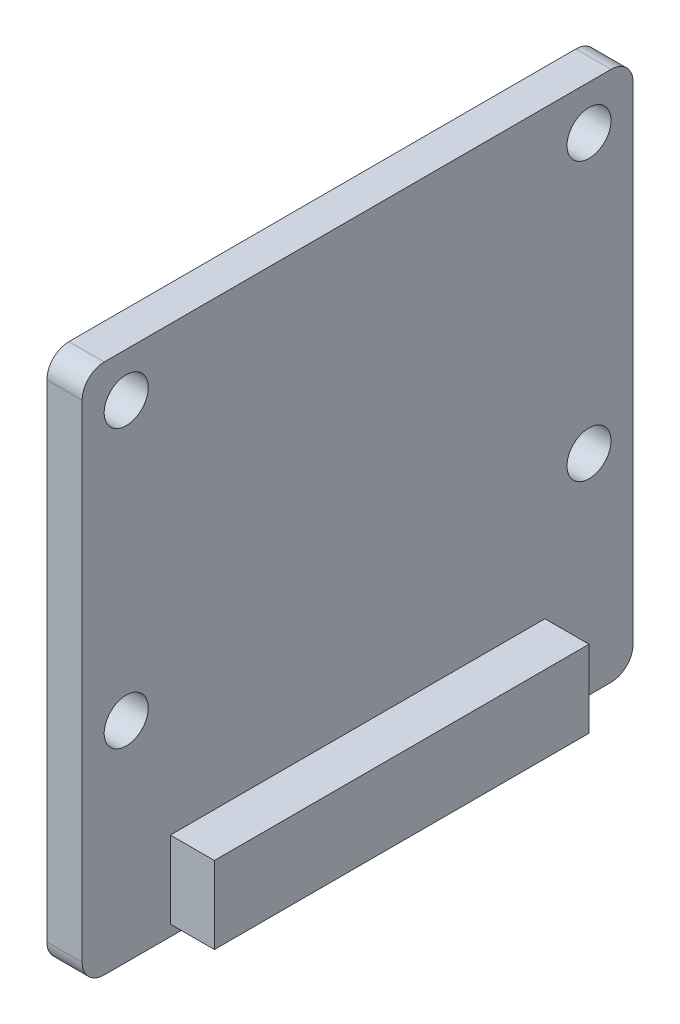
ISO-10303-21;
HEADER;
FILE_DESCRIPTION(('STEP AP214'),'2;1');
FILE_NAME('part.step','',(''),(''),'','','');
FILE_SCHEMA(('AUTOMOTIVE_DESIGN { 1 0 10303 214 1 1 1 1 }'));
ENDSEC;
DATA;
#1=APPLICATION_CONTEXT('core data for automotive mechanical design processes');
#2=APPLICATION_PROTOCOL_DEFINITION('international standard','automotive_design',2000,#1);
#3=PRODUCT_CONTEXT('',#1,'mechanical');
#4=PRODUCT('Part','Part','',(#3));
#5=PRODUCT_RELATED_PRODUCT_CATEGORY('part','',(#4));
#6=PRODUCT_DEFINITION_FORMATION('','',#4);
#7=PRODUCT_DEFINITION_CONTEXT('part definition',#1,'design');
#8=PRODUCT_DEFINITION('design','',#6,#7);
#9=PRODUCT_DEFINITION_SHAPE('','',#8);
#10=(LENGTH_UNIT() NAMED_UNIT(*) SI_UNIT(.MILLI.,.METRE.));
#11=(NAMED_UNIT(*) PLANE_ANGLE_UNIT() SI_UNIT($,.RADIAN.));
#12=(NAMED_UNIT(*) SI_UNIT($,.STERADIAN.) SOLID_ANGLE_UNIT());
#13=UNCERTAINTY_MEASURE_WITH_UNIT(LENGTH_MEASURE(1.E-05),#10,'distance_accuracy_value','');
#14=(GEOMETRIC_REPRESENTATION_CONTEXT(3) GLOBAL_UNCERTAINTY_ASSIGNED_CONTEXT((#13)) GLOBAL_UNIT_ASSIGNED_CONTEXT((#10,
#11,#12)) REPRESENTATION_CONTEXT('',''));
#15=CARTESIAN_POINT('',(0.,0.,0.));
#16=DIRECTION('',(0.,0.,1.));
#17=DIRECTION('',(1.,0.,0.));
#18=AXIS2_PLACEMENT_3D('',#15,#16,#17);
#19=CARTESIAN_POINT('',(1.6,0.,0.));
#20=DIRECTION('',(1.,0.,0.));
#21=DIRECTION('',(0.,0.,-1.));
#22=AXIS2_PLACEMENT_3D('',#19,#20,#21);
#23=PLANE('',#22);
#24=CARTESIAN_POINT('',(1.6,-8.00000000000001,-10.5));
#25=DIRECTION('',(1.,0.,0.));
#26=DIRECTION('',(0.,0.,-1.));
#27=AXIS2_PLACEMENT_3D('',#24,#25,#26);
#28=CIRCLE('',#27,1.);
#29=CARTESIAN_POINT('',(1.6,-8.00000000000001,-11.5));
#30=VERTEX_POINT('',#29);
#31=EDGE_CURVE('E410',#30,#30,#28,.T.);
#32=ORIENTED_EDGE('',*,*,#31,.F.);
#33=EDGE_LOOP('',(#32));
#34=FACE_BOUND('',#33,.T.);
#35=CARTESIAN_POINT('',(1.6,-8.00000000000001,10.5));
#36=DIRECTION('',(1.,0.,0.));
#37=DIRECTION('',(0.,0.,-1.));
#38=AXIS2_PLACEMENT_3D('',#35,#36,#37);
#39=CIRCLE('',#38,1.);
#40=CARTESIAN_POINT('',(1.6,-8.00000000000001,9.5));
#41=VERTEX_POINT('',#40);
#42=EDGE_CURVE('E411',#41,#41,#39,.T.);
#43=ORIENTED_EDGE('',*,*,#42,.F.);
#44=EDGE_LOOP('',(#43));
#45=FACE_BOUND('',#44,.T.);
#46=CARTESIAN_POINT('',(1.6,4.59,10.5));
#47=DIRECTION('',(1.,0.,0.));
#48=DIRECTION('',(0.,0.,-1.));
#49=AXIS2_PLACEMENT_3D('',#46,#47,#48);
#50=CIRCLE('',#49,1.);
#51=CARTESIAN_POINT('',(1.6,4.59,9.5));
#52=VERTEX_POINT('',#51);
#53=EDGE_CURVE('E414',#52,#52,#50,.T.);
#54=ORIENTED_EDGE('',*,*,#53,.F.);
#55=EDGE_LOOP('',(#54));
#56=FACE_BOUND('',#55,.T.);
#57=CARTESIAN_POINT('',(1.6,4.59,-10.5));
#58=DIRECTION('',(1.,0.,0.));
#59=DIRECTION('',(0.,0.,-1.));
#60=AXIS2_PLACEMENT_3D('',#57,#58,#59);
#61=CIRCLE('',#60,1.);
#62=CARTESIAN_POINT('',(1.6,4.59,-11.5));
#63=VERTEX_POINT('',#62);
#64=EDGE_CURVE('E216',#63,#63,#61,.T.);
#65=ORIENTED_EDGE('',*,*,#64,.F.);
#66=EDGE_LOOP('',(#65));
#67=FACE_BOUND('',#66,.T.);
#68=DIRECTION('',(0.,-1.,0.));
#69=VECTOR('',#68,1.);
#70=CARTESIAN_POINT('',(1.6,6.58999999999999,12.5));
#71=LINE('',#70,#69);
#72=CARTESIAN_POINT('',(1.6,5.58999999999999,12.5));
#73=VERTEX_POINT('',#72);
#74=CARTESIAN_POINT('',(1.6,-16.5,12.5));
#75=VERTEX_POINT('',#74);
#76=EDGE_CURVE('E155',#73,#75,#71,.T.);
#77=ORIENTED_EDGE('',*,*,#76,.T.);
#78=CARTESIAN_POINT('',(1.6,-16.5,11.5));
#79=DIRECTION('',(1.,0.,0.));
#80=DIRECTION('',(0.,0.,-1.));
#81=AXIS2_PLACEMENT_3D('',#78,#79,#80);
#82=CIRCLE('',#81,1.);
#83=CARTESIAN_POINT('',(1.6,-17.5,11.5));
#84=VERTEX_POINT('',#83);
#85=EDGE_CURVE('E191',#75,#84,#82,.T.);
#86=ORIENTED_EDGE('',*,*,#85,.T.);
#87=DIRECTION('',(0.,0.,-1.));
#88=VECTOR('',#87,1.);
#89=CARTESIAN_POINT('',(1.6,-17.5,12.5));
#90=LINE('',#89,#88);
#91=CARTESIAN_POINT('',(1.6,-17.5,-11.5));
#92=VERTEX_POINT('',#91);
#93=EDGE_CURVE('E176',#84,#92,#90,.T.);
#94=ORIENTED_EDGE('',*,*,#93,.T.);
#95=CARTESIAN_POINT('',(1.6,-16.5,-11.5));
#96=DIRECTION('',(1.,0.,0.));
#97=DIRECTION('',(0.,0.,-1.));
#98=AXIS2_PLACEMENT_3D('',#95,#96,#97);
#99=CIRCLE('',#98,1.);
#100=CARTESIAN_POINT('',(1.6,-16.5,-12.5));
#101=VERTEX_POINT('',#100);
#102=EDGE_CURVE('E187',#92,#101,#99,.T.);
#103=ORIENTED_EDGE('',*,*,#102,.T.);
#104=DIRECTION('',(0.,1.,0.));
#105=VECTOR('',#104,1.);
#106=CARTESIAN_POINT('',(1.6,-17.5,-12.5));
#107=LINE('',#106,#105);
#108=CARTESIAN_POINT('',(1.6,5.59,-12.5));
#109=VERTEX_POINT('',#108);
#110=EDGE_CURVE('E165',#101,#109,#107,.T.);
#111=ORIENTED_EDGE('',*,*,#110,.T.);
#112=CARTESIAN_POINT('',(1.6,5.59,-11.5));
#113=DIRECTION('',(1.,0.,0.));
#114=DIRECTION('',(0.,0.,-1.));
#115=AXIS2_PLACEMENT_3D('',#112,#113,#114);
#116=CIRCLE('',#115,1.);
#117=CARTESIAN_POINT('',(1.6,6.59,-11.5));
#118=VERTEX_POINT('',#117);
#119=EDGE_CURVE('E185',#109,#118,#116,.T.);
#120=ORIENTED_EDGE('',*,*,#119,.T.);
#121=DIRECTION('',(0.,0.,1.));
#122=VECTOR('',#121,1.);
#123=CARTESIAN_POINT('',(1.6,6.59,-12.5));
#124=LINE('',#123,#122);
#125=CARTESIAN_POINT('',(1.6,6.58999999999999,11.5));
#126=VERTEX_POINT('',#125);
#127=EDGE_CURVE('E152',#118,#126,#124,.T.);
#128=ORIENTED_EDGE('',*,*,#127,.T.);
#129=CARTESIAN_POINT('',(1.6,5.58999999999999,11.5));
#130=DIRECTION('',(1.,0.,0.));
#131=DIRECTION('',(0.,0.,-1.));
#132=AXIS2_PLACEMENT_3D('',#129,#130,#131);
#133=CIRCLE('',#132,1.);
#134=EDGE_CURVE('E189',#126,#73,#133,.T.);
#135=ORIENTED_EDGE('',*,*,#134,.T.);
#136=EDGE_LOOP('',(#77,#86,#94,#103,#111,#120,#128,#135));
#137=FACE_BOUND('',#136,.T.);
#138=DIRECTION('',(0.,1.,0.));
#139=VECTOR('',#138,1.);
#140=CARTESIAN_POINT('',(1.6,-13.5,-8.5));
#141=LINE('',#140,#139);
#142=CARTESIAN_POINT('',(1.6,-17.,-8.5));
#143=VERTEX_POINT('',#142);
#144=CARTESIAN_POINT('',(1.6,-13.5,-8.5));
#145=VERTEX_POINT('',#144);
#146=EDGE_CURVE('E225',#143,#145,#141,.T.);
#147=ORIENTED_EDGE('',*,*,#146,.F.);
#148=DIRECTION('',(0.,0.,-1.));
#149=VECTOR('',#148,1.);
#150=CARTESIAN_POINT('',(1.6,-17.,-8.5));
#151=LINE('',#150,#149);
#152=CARTESIAN_POINT('',(1.6,-17.,8.5));
#153=VERTEX_POINT('',#152);
#154=EDGE_CURVE('E150',#153,#143,#151,.T.);
#155=ORIENTED_EDGE('',*,*,#154,.F.);
#156=DIRECTION('',(0.,-1.,0.));
#157=VECTOR('',#156,1.);
#158=CARTESIAN_POINT('',(1.6,-17.,8.5));
#159=LINE('',#158,#157);
#160=CARTESIAN_POINT('',(1.6,-13.5,8.5));
#161=VERTEX_POINT('',#160);
#162=EDGE_CURVE('E146',#161,#153,#159,.T.);
#163=ORIENTED_EDGE('',*,*,#162,.F.);
#164=DIRECTION('',(0.,0.,1.));
#165=VECTOR('',#164,1.);
#166=CARTESIAN_POINT('',(1.6,-13.5,8.5));
#167=LINE('',#166,#165);
#168=EDGE_CURVE('E227',#145,#161,#167,.T.);
#169=ORIENTED_EDGE('',*,*,#168,.F.);
#170=EDGE_LOOP('',(#147,#155,#163,#169));
#171=FACE_BOUND('',#170,.T.);
#172=ADVANCED_FACE('F36',(#34,#45,#56,#67,#137,#171),#23,.T.);
#173=CARTESIAN_POINT('',(0.,6.59,-12.5));
#174=DIRECTION('',(0.,1.,0.));
#175=DIRECTION('',(0.,0.,1.));
#176=AXIS2_PLACEMENT_3D('',#173,#174,#175);
#177=PLANE('',#176);
#178=DIRECTION('',(0.,0.,1.));
#179=VECTOR('',#178,1.);
#180=CARTESIAN_POINT('',(0.,6.59,-12.5));
#181=LINE('',#180,#179);
#182=CARTESIAN_POINT('',(0.,6.59,-11.5));
#183=VERTEX_POINT('',#182);
#184=CARTESIAN_POINT('',(0.,6.58999999999999,11.5));
#185=VERTEX_POINT('',#184);
#186=EDGE_CURVE('E161',#183,#185,#181,.T.);
#187=ORIENTED_EDGE('',*,*,#186,.T.);
#188=DIRECTION('',(1.,0.,0.));
#189=VECTOR('',#188,1.);
#190=CARTESIAN_POINT('',(0.,6.58999999999999,11.5));
#191=LINE('',#190,#189);
#192=EDGE_CURVE('E207',#185,#126,#191,.T.);
#193=ORIENTED_EDGE('',*,*,#192,.T.);
#194=ORIENTED_EDGE('',*,*,#127,.F.);
#195=DIRECTION('',(1.,0.,0.));
#196=VECTOR('',#195,1.);
#197=CARTESIAN_POINT('',(0.,6.59,-11.5));
#198=LINE('',#197,#196);
#199=EDGE_CURVE('E205',#118,#183,#198,.F.);
#200=ORIENTED_EDGE('',*,*,#199,.T.);
#201=EDGE_LOOP('',(#187,#193,#194,#200));
#202=FACE_BOUND('',#201,.T.);
#203=ADVANCED_FACE('F245',(#202),#177,.T.);
#204=CARTESIAN_POINT('',(0.,-17.5,-12.5));
#205=DIRECTION('',(0.,0.,-1.));
#206=DIRECTION('',(-1.,0.,0.));
#207=AXIS2_PLACEMENT_3D('',#204,#205,#206);
#208=PLANE('',#207);
#209=ORIENTED_EDGE('',*,*,#110,.F.);
#210=DIRECTION('',(1.,0.,0.));
#211=VECTOR('',#210,1.);
#212=CARTESIAN_POINT('',(0.,-16.5,-12.5));
#213=LINE('',#212,#211);
#214=CARTESIAN_POINT('',(0.,-16.5,-12.5));
#215=VERTEX_POINT('',#214);
#216=EDGE_CURVE('E11',#101,#215,#213,.F.);
#217=ORIENTED_EDGE('',*,*,#216,.T.);
#218=DIRECTION('',(0.,1.,0.));
#219=VECTOR('',#218,1.);
#220=CARTESIAN_POINT('',(0.,-17.5,-12.5));
#221=LINE('',#220,#219);
#222=CARTESIAN_POINT('',(0.,5.59,-12.5));
#223=VERTEX_POINT('',#222);
#224=EDGE_CURVE('E171',#215,#223,#221,.T.);
#225=ORIENTED_EDGE('',*,*,#224,.T.);
#226=DIRECTION('',(1.,0.,0.));
#227=VECTOR('',#226,1.);
#228=CARTESIAN_POINT('',(0.,5.59,-12.5));
#229=LINE('',#228,#227);
#230=EDGE_CURVE('E45',#223,#109,#229,.T.);
#231=ORIENTED_EDGE('',*,*,#230,.T.);
#232=EDGE_LOOP('',(#209,#217,#225,#231));
#233=FACE_BOUND('',#232,.T.);
#234=ADVANCED_FACE('F251',(#233),#208,.T.);
#235=CARTESIAN_POINT('',(0.,-17.5,12.5));
#236=DIRECTION('',(0.,-1.,0.));
#237=DIRECTION('',(0.,0.,-1.));
#238=AXIS2_PLACEMENT_3D('',#235,#236,#237);
#239=PLANE('',#238);
#240=ORIENTED_EDGE('',*,*,#93,.F.);
#241=DIRECTION('',(1.,0.,0.));
#242=VECTOR('',#241,1.);
#243=CARTESIAN_POINT('',(0.,-17.5,11.5));
#244=LINE('',#243,#242);
#245=CARTESIAN_POINT('',(0.,-17.5,11.5));
#246=VERTEX_POINT('',#245);
#247=EDGE_CURVE('E196',#84,#246,#244,.F.);
#248=ORIENTED_EDGE('',*,*,#247,.T.);
#249=DIRECTION('',(0.,0.,-1.));
#250=VECTOR('',#249,1.);
#251=CARTESIAN_POINT('',(0.,-17.5,12.5));
#252=LINE('',#251,#250);
#253=CARTESIAN_POINT('',(0.,-17.5,-11.5));
#254=VERTEX_POINT('',#253);
#255=EDGE_CURVE('E168',#246,#254,#252,.T.);
#256=ORIENTED_EDGE('',*,*,#255,.T.);
#257=DIRECTION('',(1.,0.,0.));
#258=VECTOR('',#257,1.);
#259=CARTESIAN_POINT('',(0.,-17.5,-11.5));
#260=LINE('',#259,#258);
#261=EDGE_CURVE('E193',#254,#92,#260,.T.);
#262=ORIENTED_EDGE('',*,*,#261,.T.);
#263=EDGE_LOOP('',(#240,#248,#256,#262));
#264=FACE_BOUND('',#263,.T.);
#265=ADVANCED_FACE('F262',(#264),#239,.T.);
#266=CARTESIAN_POINT('',(0.,6.58999999999999,12.5));
#267=DIRECTION('',(0.,0.,1.));
#268=DIRECTION('',(1.,0.,0.));
#269=AXIS2_PLACEMENT_3D('',#266,#267,#268);
#270=PLANE('',#269);
#271=DIRECTION('',(0.,-1.,0.));
#272=VECTOR('',#271,1.);
#273=CARTESIAN_POINT('',(0.,6.58999999999999,12.5));
#274=LINE('',#273,#272);
#275=CARTESIAN_POINT('',(0.,5.58999999999999,12.5));
#276=VERTEX_POINT('',#275);
#277=CARTESIAN_POINT('',(0.,-16.5,12.5));
#278=VERTEX_POINT('',#277);
#279=EDGE_CURVE('E164',#276,#278,#274,.T.);
#280=ORIENTED_EDGE('',*,*,#279,.T.);
#281=DIRECTION('',(1.,0.,0.));
#282=VECTOR('',#281,1.);
#283=CARTESIAN_POINT('',(0.,-16.5,12.5));
#284=LINE('',#283,#282);
#285=EDGE_CURVE('E182',#278,#75,#284,.T.);
#286=ORIENTED_EDGE('',*,*,#285,.T.);
#287=ORIENTED_EDGE('',*,*,#76,.F.);
#288=DIRECTION('',(1.,0.,0.));
#289=VECTOR('',#288,1.);
#290=CARTESIAN_POINT('',(0.,5.58999999999999,12.5));
#291=LINE('',#290,#289);
#292=EDGE_CURVE('E172',#73,#276,#291,.F.);
#293=ORIENTED_EDGE('',*,*,#292,.T.);
#294=EDGE_LOOP('',(#280,#286,#287,#293));
#295=FACE_BOUND('',#294,.T.);
#296=ADVANCED_FACE('F265',(#295),#270,.T.);
#297=CARTESIAN_POINT('',(0.,0.,0.));
#298=DIRECTION('',(1.,0.,0.));
#299=DIRECTION('',(0.,0.,-1.));
#300=AXIS2_PLACEMENT_3D('',#297,#298,#299);
#301=PLANE('',#300);
#302=CARTESIAN_POINT('',(0.,-8.00000000000001,-10.5));
#303=DIRECTION('',(1.,0.,0.));
#304=DIRECTION('',(0.,0.,-1.));
#305=AXIS2_PLACEMENT_3D('',#302,#303,#304);
#306=CIRCLE('',#305,1.);
#307=CARTESIAN_POINT('',(0.,-8.00000000000001,-11.5));
#308=VERTEX_POINT('',#307);
#309=EDGE_CURVE('E40',#308,#308,#306,.T.);
#310=ORIENTED_EDGE('',*,*,#309,.T.);
#311=EDGE_LOOP('',(#310));
#312=FACE_BOUND('',#311,.T.);
#313=CARTESIAN_POINT('',(0.,-8.00000000000001,10.5));
#314=DIRECTION('',(1.,0.,0.));
#315=DIRECTION('',(0.,0.,-1.));
#316=AXIS2_PLACEMENT_3D('',#313,#314,#315);
#317=CIRCLE('',#316,1.);
#318=CARTESIAN_POINT('',(0.,-8.00000000000001,9.5));
#319=VERTEX_POINT('',#318);
#320=EDGE_CURVE('E218',#319,#319,#317,.T.);
#321=ORIENTED_EDGE('',*,*,#320,.T.);
#322=EDGE_LOOP('',(#321));
#323=FACE_BOUND('',#322,.T.);
#324=CARTESIAN_POINT('',(0.,4.59,10.5));
#325=DIRECTION('',(1.,0.,0.));
#326=DIRECTION('',(0.,0.,-1.));
#327=AXIS2_PLACEMENT_3D('',#324,#325,#326);
#328=CIRCLE('',#327,1.);
#329=CARTESIAN_POINT('',(0.,4.59,9.5));
#330=VERTEX_POINT('',#329);
#331=EDGE_CURVE('E215',#330,#330,#328,.T.);
#332=ORIENTED_EDGE('',*,*,#331,.T.);
#333=EDGE_LOOP('',(#332));
#334=FACE_BOUND('',#333,.T.);
#335=CARTESIAN_POINT('',(0.,4.59,-10.5));
#336=DIRECTION('',(1.,0.,0.));
#337=DIRECTION('',(0.,0.,-1.));
#338=AXIS2_PLACEMENT_3D('',#335,#336,#337);
#339=CIRCLE('',#338,1.);
#340=CARTESIAN_POINT('',(0.,4.59,-11.5));
#341=VERTEX_POINT('',#340);
#342=EDGE_CURVE('E212',#341,#341,#339,.T.);
#343=ORIENTED_EDGE('',*,*,#342,.T.);
#344=EDGE_LOOP('',(#343));
#345=FACE_BOUND('',#344,.T.);
#346=ORIENTED_EDGE('',*,*,#255,.F.);
#347=CARTESIAN_POINT('',(0.,-16.5,11.5));
#348=DIRECTION('',(1.,0.,0.));
#349=DIRECTION('',(0.,0.,-1.));
#350=AXIS2_PLACEMENT_3D('',#347,#348,#349);
#351=CIRCLE('',#350,1.);
#352=EDGE_CURVE('E203',#246,#278,#351,.F.);
#353=ORIENTED_EDGE('',*,*,#352,.T.);
#354=ORIENTED_EDGE('',*,*,#279,.F.);
#355=CARTESIAN_POINT('',(0.,5.58999999999999,11.5));
#356=DIRECTION('',(1.,0.,0.));
#357=DIRECTION('',(0.,0.,-1.));
#358=AXIS2_PLACEMENT_3D('',#355,#356,#357);
#359=CIRCLE('',#358,1.);
#360=EDGE_CURVE('E201',#276,#185,#359,.F.);
#361=ORIENTED_EDGE('',*,*,#360,.T.);
#362=ORIENTED_EDGE('',*,*,#186,.F.);
#363=CARTESIAN_POINT('',(0.,5.59,-11.5));
#364=DIRECTION('',(1.,0.,0.));
#365=DIRECTION('',(0.,0.,-1.));
#366=AXIS2_PLACEMENT_3D('',#363,#364,#365);
#367=CIRCLE('',#366,1.);
#368=EDGE_CURVE('E53',#183,#223,#367,.F.);
#369=ORIENTED_EDGE('',*,*,#368,.T.);
#370=ORIENTED_EDGE('',*,*,#224,.F.);
#371=CARTESIAN_POINT('',(0.,-16.5,-11.5));
#372=DIRECTION('',(1.,0.,0.));
#373=DIRECTION('',(0.,0.,-1.));
#374=AXIS2_PLACEMENT_3D('',#371,#372,#373);
#375=CIRCLE('',#374,1.);
#376=EDGE_CURVE('E199',#215,#254,#375,.F.);
#377=ORIENTED_EDGE('',*,*,#376,.T.);
#378=EDGE_LOOP('',(#346,#353,#354,#361,#362,#369,#370,#377));
#379=FACE_BOUND('',#378,.T.);
#380=ADVANCED_FACE('F258',(#312,#323,#334,#345,#379),#301,.F.);
#381=CARTESIAN_POINT('',(3.6,-17.,-8.5));
#382=DIRECTION('',(0.,1.,0.));
#383=DIRECTION('',(0.,0.,1.));
#384=AXIS2_PLACEMENT_3D('',#381,#382,#383);
#385=PLANE('',#384);
#386=ORIENTED_EDGE('',*,*,#154,.T.);
#387=DIRECTION('',(-1.,0.,0.));
#388=VECTOR('',#387,1.);
#389=CARTESIAN_POINT('',(3.6,-17.,-8.5));
#390=LINE('',#389,#388);
#391=CARTESIAN_POINT('',(3.6,-17.,-8.5));
#392=VERTEX_POINT('',#391);
#393=EDGE_CURVE('E130',#392,#143,#390,.T.);
#394=ORIENTED_EDGE('',*,*,#393,.F.);
#395=DIRECTION('',(0.,0.,-1.));
#396=VECTOR('',#395,1.);
#397=CARTESIAN_POINT('',(3.6,-17.,-8.5));
#398=LINE('',#397,#396);
#399=CARTESIAN_POINT('',(3.6,-17.,8.5));
#400=VERTEX_POINT('',#399);
#401=EDGE_CURVE('E137',#400,#392,#398,.T.);
#402=ORIENTED_EDGE('',*,*,#401,.F.);
#403=DIRECTION('',(-1.,0.,0.));
#404=VECTOR('',#403,1.);
#405=CARTESIAN_POINT('',(3.6,-17.,8.5));
#406=LINE('',#405,#404);
#407=EDGE_CURVE('E235',#400,#153,#406,.T.);
#408=ORIENTED_EDGE('',*,*,#407,.T.);
#409=EDGE_LOOP('',(#386,#394,#402,#408));
#410=FACE_BOUND('',#409,.T.);
#411=ADVANCED_FACE('F148',(#410),#385,.F.);
#412=CARTESIAN_POINT('',(3.6,-13.5,-8.5));
#413=DIRECTION('',(0.,0.,1.));
#414=DIRECTION('',(1.,0.,0.));
#415=AXIS2_PLACEMENT_3D('',#412,#413,#414);
#416=PLANE('',#415);
#417=ORIENTED_EDGE('',*,*,#146,.T.);
#418=DIRECTION('',(-1.,0.,0.));
#419=VECTOR('',#418,1.);
#420=CARTESIAN_POINT('',(3.6,-13.5,-8.5));
#421=LINE('',#420,#419);
#422=CARTESIAN_POINT('',(3.6,-13.5,-8.5));
#423=VERTEX_POINT('',#422);
#424=EDGE_CURVE('E133',#423,#145,#421,.T.);
#425=ORIENTED_EDGE('',*,*,#424,.F.);
#426=DIRECTION('',(0.,1.,0.));
#427=VECTOR('',#426,1.);
#428=CARTESIAN_POINT('',(3.6,-13.5,-8.5));
#429=LINE('',#428,#427);
#430=EDGE_CURVE('E126',#392,#423,#429,.T.);
#431=ORIENTED_EDGE('',*,*,#430,.F.);
#432=ORIENTED_EDGE('',*,*,#393,.T.);
#433=EDGE_LOOP('',(#417,#425,#431,#432));
#434=FACE_BOUND('',#433,.T.);
#435=ADVANCED_FACE('F128',(#434),#416,.F.);
#436=CARTESIAN_POINT('',(3.6,-13.5,8.5));
#437=DIRECTION('',(0.,-1.,0.));
#438=DIRECTION('',(0.,0.,-1.));
#439=AXIS2_PLACEMENT_3D('',#436,#437,#438);
#440=PLANE('',#439);
#441=ORIENTED_EDGE('',*,*,#168,.T.);
#442=DIRECTION('',(-1.,0.,0.));
#443=VECTOR('',#442,1.);
#444=CARTESIAN_POINT('',(3.6,-13.5,8.5));
#445=LINE('',#444,#443);
#446=CARTESIAN_POINT('',(3.6,-13.5,8.5));
#447=VERTEX_POINT('',#446);
#448=EDGE_CURVE('E157',#447,#161,#445,.T.);
#449=ORIENTED_EDGE('',*,*,#448,.F.);
#450=DIRECTION('',(0.,0.,1.));
#451=VECTOR('',#450,1.);
#452=CARTESIAN_POINT('',(3.6,-13.5,8.5));
#453=LINE('',#452,#451);
#454=EDGE_CURVE('E136',#423,#447,#453,.T.);
#455=ORIENTED_EDGE('',*,*,#454,.F.);
#456=ORIENTED_EDGE('',*,*,#424,.T.);
#457=EDGE_LOOP('',(#441,#449,#455,#456));
#458=FACE_BOUND('',#457,.T.);
#459=ADVANCED_FACE('F242',(#458),#440,.F.);
#460=CARTESIAN_POINT('',(3.6,-17.,8.5));
#461=DIRECTION('',(0.,0.,-1.));
#462=DIRECTION('',(-1.,0.,0.));
#463=AXIS2_PLACEMENT_3D('',#460,#461,#462);
#464=PLANE('',#463);
#465=ORIENTED_EDGE('',*,*,#162,.T.);
#466=ORIENTED_EDGE('',*,*,#407,.F.);
#467=DIRECTION('',(0.,-1.,0.));
#468=VECTOR('',#467,1.);
#469=CARTESIAN_POINT('',(3.6,-17.,8.5));
#470=LINE('',#469,#468);
#471=EDGE_CURVE('E142',#447,#400,#470,.T.);
#472=ORIENTED_EDGE('',*,*,#471,.F.);
#473=ORIENTED_EDGE('',*,*,#448,.T.);
#474=EDGE_LOOP('',(#465,#466,#472,#473));
#475=FACE_BOUND('',#474,.T.);
#476=ADVANCED_FACE('F238',(#475),#464,.F.);
#477=CARTESIAN_POINT('',(3.6,0.,0.));
#478=DIRECTION('',(-1.,0.,0.));
#479=DIRECTION('',(0.,0.,1.));
#480=AXIS2_PLACEMENT_3D('',#477,#478,#479);
#481=PLANE('',#480);
#482=ORIENTED_EDGE('',*,*,#401,.T.);
#483=ORIENTED_EDGE('',*,*,#430,.T.);
#484=ORIENTED_EDGE('',*,*,#454,.T.);
#485=ORIENTED_EDGE('',*,*,#471,.T.);
#486=EDGE_LOOP('',(#482,#483,#484,#485));
#487=FACE_BOUND('',#486,.T.);
#488=ADVANCED_FACE('F140',(#487),#481,.F.);
#489=CARTESIAN_POINT('',(0.,-16.5,11.5));
#490=DIRECTION('',(1.,0.,0.));
#491=DIRECTION('',(0.,0.,-1.));
#492=AXIS2_PLACEMENT_3D('',#489,#490,#491);
#493=CYLINDRICAL_SURFACE('',#492,1.);
#494=ORIENTED_EDGE('',*,*,#352,.F.);
#495=ORIENTED_EDGE('',*,*,#247,.F.);
#496=ORIENTED_EDGE('',*,*,#85,.F.);
#497=ORIENTED_EDGE('',*,*,#285,.F.);
#498=EDGE_LOOP('',(#494,#495,#496,#497));
#499=FACE_BOUND('',#498,.T.);
#500=ADVANCED_FACE('F270',(#499),#493,.T.);
#501=CARTESIAN_POINT('',(0.,5.58999999999999,11.5));
#502=DIRECTION('',(1.,0.,0.));
#503=DIRECTION('',(0.,0.,-1.));
#504=AXIS2_PLACEMENT_3D('',#501,#502,#503);
#505=CYLINDRICAL_SURFACE('',#504,1.);
#506=ORIENTED_EDGE('',*,*,#360,.F.);
#507=ORIENTED_EDGE('',*,*,#292,.F.);
#508=ORIENTED_EDGE('',*,*,#134,.F.);
#509=ORIENTED_EDGE('',*,*,#192,.F.);
#510=EDGE_LOOP('',(#506,#507,#508,#509));
#511=FACE_BOUND('',#510,.T.);
#512=ADVANCED_FACE('F273',(#511),#505,.T.);
#513=CARTESIAN_POINT('',(0.,-16.5,-11.5));
#514=DIRECTION('',(1.,0.,0.));
#515=DIRECTION('',(0.,0.,-1.));
#516=AXIS2_PLACEMENT_3D('',#513,#514,#515);
#517=CYLINDRICAL_SURFACE('',#516,1.);
#518=ORIENTED_EDGE('',*,*,#376,.F.);
#519=ORIENTED_EDGE('',*,*,#216,.F.);
#520=ORIENTED_EDGE('',*,*,#102,.F.);
#521=ORIENTED_EDGE('',*,*,#261,.F.);
#522=EDGE_LOOP('',(#518,#519,#520,#521));
#523=FACE_BOUND('',#522,.T.);
#524=ADVANCED_FACE('F276',(#523),#517,.T.);
#525=CARTESIAN_POINT('',(0.,5.59,-11.5));
#526=DIRECTION('',(1.,0.,0.));
#527=DIRECTION('',(0.,0.,-1.));
#528=AXIS2_PLACEMENT_3D('',#525,#526,#527);
#529=CYLINDRICAL_SURFACE('',#528,1.);
#530=ORIENTED_EDGE('',*,*,#368,.F.);
#531=ORIENTED_EDGE('',*,*,#199,.F.);
#532=ORIENTED_EDGE('',*,*,#119,.F.);
#533=ORIENTED_EDGE('',*,*,#230,.F.);
#534=EDGE_LOOP('',(#530,#531,#532,#533));
#535=FACE_BOUND('',#534,.T.);
#536=ADVANCED_FACE('F38',(#535),#529,.T.);
#537=CARTESIAN_POINT('',(-8.4,4.59,-10.5));
#538=DIRECTION('',(1.,0.,0.));
#539=DIRECTION('',(0.,0.,-1.));
#540=AXIS2_PLACEMENT_3D('',#537,#538,#539);
#541=CYLINDRICAL_SURFACE('',#540,1.);
#542=ORIENTED_EDGE('',*,*,#64,.T.);
#543=EDGE_LOOP('',(#542));
#544=FACE_BOUND('',#543,.T.);
#545=ORIENTED_EDGE('',*,*,#342,.F.);
#546=EDGE_LOOP('',(#545));
#547=FACE_BOUND('',#546,.T.);
#548=ADVANCED_FACE('F283',(#544,#547),#541,.F.);
#549=CARTESIAN_POINT('',(-8.4,4.59,10.5));
#550=DIRECTION('',(1.,0.,0.));
#551=DIRECTION('',(0.,0.,-1.));
#552=AXIS2_PLACEMENT_3D('',#549,#550,#551);
#553=CYLINDRICAL_SURFACE('',#552,1.);
#554=ORIENTED_EDGE('',*,*,#53,.T.);
#555=EDGE_LOOP('',(#554));
#556=FACE_BOUND('',#555,.T.);
#557=ORIENTED_EDGE('',*,*,#331,.F.);
#558=EDGE_LOOP('',(#557));
#559=FACE_BOUND('',#558,.T.);
#560=ADVANCED_FACE('F311',(#556,#559),#553,.F.);
#561=CARTESIAN_POINT('',(-8.4,-8.00000000000001,10.5));
#562=DIRECTION('',(1.,0.,0.));
#563=DIRECTION('',(0.,0.,-1.));
#564=AXIS2_PLACEMENT_3D('',#561,#562,#563);
#565=CYLINDRICAL_SURFACE('',#564,1.);
#566=ORIENTED_EDGE('',*,*,#42,.T.);
#567=EDGE_LOOP('',(#566));
#568=FACE_BOUND('',#567,.T.);
#569=ORIENTED_EDGE('',*,*,#320,.F.);
#570=EDGE_LOOP('',(#569));
#571=FACE_BOUND('',#570,.T.);
#572=ADVANCED_FACE('F317',(#568,#571),#565,.F.);
#573=CARTESIAN_POINT('',(-8.4,-8.00000000000001,-10.5));
#574=DIRECTION('',(1.,0.,0.));
#575=DIRECTION('',(0.,0.,-1.));
#576=AXIS2_PLACEMENT_3D('',#573,#574,#575);
#577=CYLINDRICAL_SURFACE('',#576,1.);
#578=ORIENTED_EDGE('',*,*,#31,.T.);
#579=EDGE_LOOP('',(#578));
#580=FACE_BOUND('',#579,.T.);
#581=ORIENTED_EDGE('',*,*,#309,.F.);
#582=EDGE_LOOP('',(#581));
#583=FACE_BOUND('',#582,.T.);
#584=ADVANCED_FACE('F323',(#580,#583),#577,.F.);
#585=CLOSED_SHELL('',(#172,#203,#234,#265,#296,#380,#411,#435,#459,#476,#488,#500,#512,#524,
#536,#548,#560,#572,#584));
#586=MANIFOLD_SOLID_BREP('B2',#585);
#587=ADVANCED_BREP_SHAPE_REPRESENTATION('',(#18,#586),#14);
#588=SHAPE_DEFINITION_REPRESENTATION(#9,#587);
ENDSEC;
END-ISO-10303-21;
